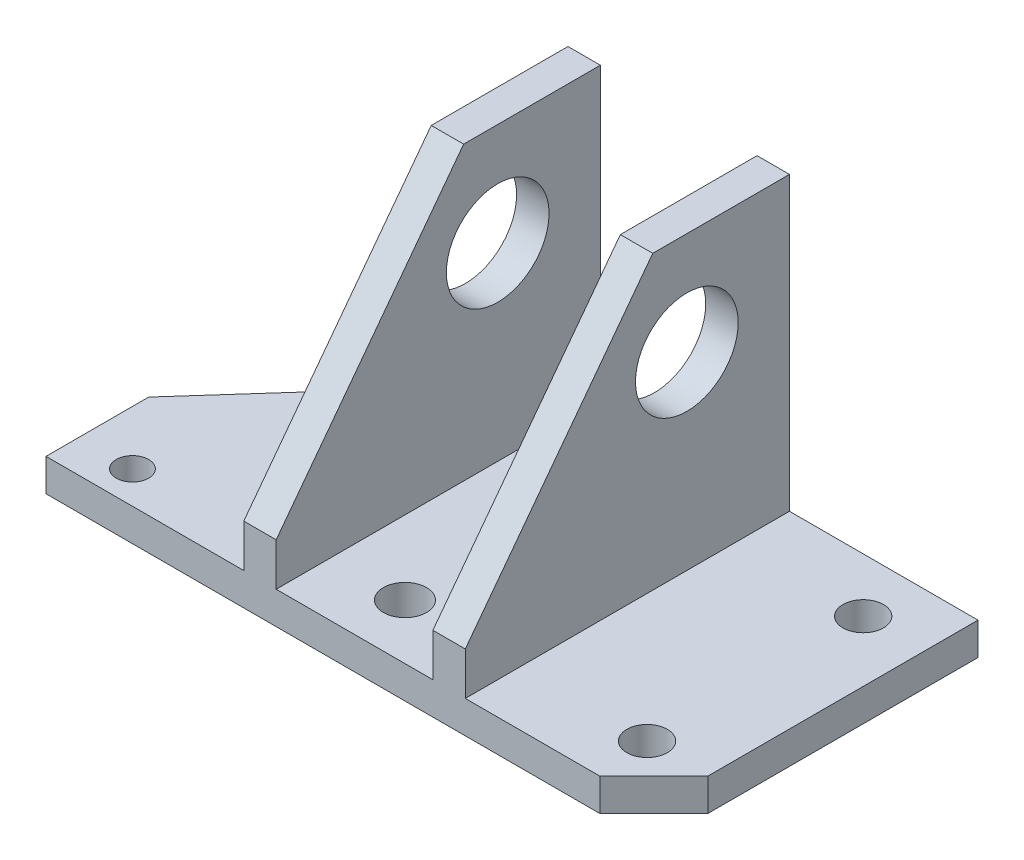
ISO-10303-21;
HEADER;
FILE_DESCRIPTION(('STEP AP214'),'2;1');
FILE_NAME('part.step','',(''),(''),'','','');
FILE_SCHEMA(('AUTOMOTIVE_DESIGN { 1 0 10303 214 1 1 1 1 }'));
ENDSEC;
DATA;
#1=APPLICATION_CONTEXT('core data for automotive mechanical design processes');
#2=APPLICATION_PROTOCOL_DEFINITION('international standard','automotive_design',2000,#1);
#3=PRODUCT_CONTEXT('',#1,'mechanical');
#4=PRODUCT('Part','Part','',(#3));
#5=PRODUCT_RELATED_PRODUCT_CATEGORY('part','',(#4));
#6=PRODUCT_DEFINITION_FORMATION('','',#4);
#7=PRODUCT_DEFINITION_CONTEXT('part definition',#1,'design');
#8=PRODUCT_DEFINITION('design','',#6,#7);
#9=PRODUCT_DEFINITION_SHAPE('','',#8);
#10=(LENGTH_UNIT() NAMED_UNIT(*) SI_UNIT(.MILLI.,.METRE.));
#11=(NAMED_UNIT(*) PLANE_ANGLE_UNIT() SI_UNIT($,.RADIAN.));
#12=(NAMED_UNIT(*) SI_UNIT($,.STERADIAN.) SOLID_ANGLE_UNIT());
#13=UNCERTAINTY_MEASURE_WITH_UNIT(LENGTH_MEASURE(1.E-05),#10,'distance_accuracy_value','');
#14=(GEOMETRIC_REPRESENTATION_CONTEXT(3) GLOBAL_UNCERTAINTY_ASSIGNED_CONTEXT((#13)) GLOBAL_UNIT_ASSIGNED_CONTEXT((#10,
#11,#12)) REPRESENTATION_CONTEXT('',''));
#15=CARTESIAN_POINT('',(0.,0.,0.));
#16=DIRECTION('',(0.,0.,1.));
#17=DIRECTION('',(1.,0.,0.));
#18=AXIS2_PLACEMENT_3D('',#15,#16,#17);
#19=CARTESIAN_POINT('',(-39.2880274057925,0.,60.));
#20=DIRECTION('',(0.,-1.,0.));
#21=DIRECTION('',(0.,0.,-1.));
#22=AXIS2_PLACEMENT_3D('',#19,#20,#21);
#23=PLANE('',#22);
#24=CARTESIAN_POINT('',(-92.5,0.,48.));
#25=DIRECTION('',(0.,1.,0.));
#26=DIRECTION('',(0.,0.,1.));
#27=AXIS2_PLACEMENT_3D('',#24,#25,#26);
#28=CIRCLE('',#27,6.);
#29=CARTESIAN_POINT('',(-92.5,0.,54.));
#30=VERTEX_POINT('',#29);
#31=EDGE_CURVE('E356',#30,#30,#28,.T.);
#32=ORIENTED_EDGE('',*,*,#31,.F.);
#33=EDGE_LOOP('',(#32));
#34=FACE_BOUND('',#33,.T.);
#35=DIRECTION('',(0.,0.,-1.));
#36=VECTOR('',#35,1.);
#37=CARTESIAN_POINT('',(-39.2880274057925,0.,60.));
#38=LINE('',#37,#36);
#39=CARTESIAN_POINT('',(-39.2880274057925,0.,60.));
#40=VERTEX_POINT('',#39);
#41=CARTESIAN_POINT('',(-39.2880274057925,0.,-60.));
#42=VERTEX_POINT('',#41);
#43=EDGE_CURVE('E162',#40,#42,#38,.T.);
#44=ORIENTED_EDGE('',*,*,#43,.T.);
#45=DIRECTION('',(0.666015736772443,0.,-0.745937690676279));
#46=VECTOR('',#45,1.);
#47=CARTESIAN_POINT('',(-51.6691380192781,0.,-46.1331548954279));
#48=LINE('',#47,#46);
#49=CARTESIAN_POINT('',(-112.5,0.,21.9974165046452));
#50=VERTEX_POINT('',#49);
#51=EDGE_CURVE('E259',#50,#42,#48,.T.);
#52=ORIENTED_EDGE('',*,*,#51,.F.);
#53=DIRECTION('',(0.,0.,-1.));
#54=VECTOR('',#53,1.);
#55=CARTESIAN_POINT('',(-112.5,0.,60.));
#56=LINE('',#55,#54);
#57=CARTESIAN_POINT('',(-112.5,0.,60.));
#58=VERTEX_POINT('',#57);
#59=EDGE_CURVE('E220',#58,#50,#56,.T.);
#60=ORIENTED_EDGE('',*,*,#59,.F.);
#61=DIRECTION('',(-1.,0.,0.));
#62=VECTOR('',#61,1.);
#63=CARTESIAN_POINT('',(-39.2880274057925,0.,60.));
#64=LINE('',#63,#62);
#65=EDGE_CURVE('E194',#40,#58,#64,.T.);
#66=ORIENTED_EDGE('',*,*,#65,.F.);
#67=EDGE_LOOP('',(#44,#52,#60,#66));
#68=FACE_BOUND('',#67,.T.);
#69=ADVANCED_FACE('F33',(#34,#68),#23,.F.);
#70=CARTESIAN_POINT('',(-112.5,0.,60.));
#71=DIRECTION('',(1.,0.,0.));
#72=DIRECTION('',(0.,0.,-1.));
#73=AXIS2_PLACEMENT_3D('',#70,#71,#72);
#74=PLANE('',#73);
#75=ORIENTED_EDGE('',*,*,#59,.T.);
#76=DIRECTION('',(0.,1.,0.));
#77=VECTOR('',#76,1.);
#78=CARTESIAN_POINT('',(-112.5,-120.,21.9974165046452));
#79=LINE('',#78,#77);
#80=CARTESIAN_POINT('',(-112.5,-12.,21.9974165046452));
#81=VERTEX_POINT('',#80);
#82=EDGE_CURVE('E261',#81,#50,#79,.T.);
#83=ORIENTED_EDGE('',*,*,#82,.F.);
#84=DIRECTION('',(0.,0.,-1.));
#85=VECTOR('',#84,1.);
#86=CARTESIAN_POINT('',(-112.5,-12.,60.));
#87=LINE('',#86,#85);
#88=CARTESIAN_POINT('',(-112.5,-12.,60.));
#89=VERTEX_POINT('',#88);
#90=EDGE_CURVE('E217',#89,#81,#87,.T.);
#91=ORIENTED_EDGE('',*,*,#90,.F.);
#92=DIRECTION('',(0.,-1.,0.));
#93=VECTOR('',#92,1.);
#94=CARTESIAN_POINT('',(-112.5,0.,60.));
#95=LINE('',#94,#93);
#96=EDGE_CURVE('E274',#58,#89,#95,.T.);
#97=ORIENTED_EDGE('',*,*,#96,.F.);
#98=EDGE_LOOP('',(#75,#83,#91,#97));
#99=FACE_BOUND('',#98,.T.);
#100=ADVANCED_FACE('F310',(#99),#74,.F.);
#101=CARTESIAN_POINT('',(-112.5,-12.,60.));
#102=DIRECTION('',(0.,1.,0.));
#103=DIRECTION('',(-1.,0.,0.));
#104=AXIS2_PLACEMENT_3D('',#101,#102,#103);
#105=PLANE('',#104);
#106=CARTESIAN_POINT('',(90.,-12.,-40.));
#107=DIRECTION('',(0.,1.,0.));
#108=DIRECTION('',(-1.,0.,0.));
#109=AXIS2_PLACEMENT_3D('',#106,#107,#108);
#110=CIRCLE('',#109,7.50747814202877);
#111=CARTESIAN_POINT('',(82.4925218579712,-12.,-40.));
#112=VERTEX_POINT('',#111);
#113=EDGE_CURVE('E372',#112,#112,#110,.T.);
#114=ORIENTED_EDGE('',*,*,#113,.T.);
#115=EDGE_LOOP('',(#114));
#116=FACE_BOUND('',#115,.T.);
#117=CARTESIAN_POINT('',(0.,-12.,39.6259148494393));
#118=DIRECTION('',(0.,1.,0.));
#119=DIRECTION('',(-1.,0.,0.));
#120=AXIS2_PLACEMENT_3D('',#117,#118,#119);
#121=CIRCLE('',#120,8.);
#122=CARTESIAN_POINT('',(-8.,-12.,39.6259148494393));
#123=VERTEX_POINT('',#122);
#124=EDGE_CURVE('E358',#123,#123,#121,.T.);
#125=ORIENTED_EDGE('',*,*,#124,.T.);
#126=EDGE_LOOP('',(#125));
#127=FACE_BOUND('',#126,.T.);
#128=CARTESIAN_POINT('',(90.,-12.,40.));
#129=DIRECTION('',(0.,1.,0.));
#130=DIRECTION('',(-1.,0.,0.));
#131=AXIS2_PLACEMENT_3D('',#128,#129,#130);
#132=CIRCLE('',#131,7.50747814202877);
#133=CARTESIAN_POINT('',(82.4925218579712,-12.,40.));
#134=VERTEX_POINT('',#133);
#135=EDGE_CURVE('E362',#134,#134,#132,.T.);
#136=ORIENTED_EDGE('',*,*,#135,.T.);
#137=EDGE_LOOP('',(#136));
#138=FACE_BOUND('',#137,.T.);
#139=CARTESIAN_POINT('',(-92.5,-12.,48.));
#140=DIRECTION('',(0.,1.,0.));
#141=DIRECTION('',(-1.,0.,0.));
#142=AXIS2_PLACEMENT_3D('',#139,#140,#141);
#143=CIRCLE('',#142,6.);
#144=CARTESIAN_POINT('',(-98.5,-12.,48.));
#145=VERTEX_POINT('',#144);
#146=EDGE_CURVE('E36',#145,#145,#143,.T.);
#147=ORIENTED_EDGE('',*,*,#146,.T.);
#148=EDGE_LOOP('',(#147));
#149=FACE_BOUND('',#148,.T.);
#150=CARTESIAN_POINT('',(0.,-12.,-39.6259148494393));
#151=DIRECTION('',(0.,1.,0.));
#152=DIRECTION('',(-1.,0.,0.));
#153=AXIS2_PLACEMENT_3D('',#150,#151,#152);
#154=CIRCLE('',#153,8.);
#155=CARTESIAN_POINT('',(-8.,-12.,-39.6259148494393));
#156=VERTEX_POINT('',#155);
#157=EDGE_CURVE('E230',#156,#156,#154,.T.);
#158=ORIENTED_EDGE('',*,*,#157,.T.);
#159=EDGE_LOOP('',(#158));
#160=FACE_BOUND('',#159,.T.);
#161=ORIENTED_EDGE('',*,*,#90,.T.);
#162=DIRECTION('',(0.666015736772443,0.,-0.745937690676279));
#163=VECTOR('',#162,1.);
#164=CARTESIAN_POINT('',(-131.379920641015,-12.,43.1429294790956));
#165=LINE('',#164,#163);
#166=CARTESIAN_POINT('',(-39.2880274057925,-12.,-60.));
#167=VERTEX_POINT('',#166);
#168=EDGE_CURVE('E263',#81,#167,#165,.T.);
#169=ORIENTED_EDGE('',*,*,#168,.T.);
#170=DIRECTION('',(1.,0.,0.));
#171=VECTOR('',#170,1.);
#172=CARTESIAN_POINT('',(-112.5,-12.,-60.));
#173=LINE('',#172,#171);
#174=CARTESIAN_POINT('',(112.5,-12.,-60.));
#175=VERTEX_POINT('',#174);
#176=EDGE_CURVE('E168',#167,#175,#173,.T.);
#177=ORIENTED_EDGE('',*,*,#176,.T.);
#178=DIRECTION('',(0.,0.,-1.));
#179=VECTOR('',#178,1.);
#180=CARTESIAN_POINT('',(112.5,-12.,60.));
#181=LINE('',#180,#179);
#182=CARTESIAN_POINT('',(112.5,-12.,40.0044285512044));
#183=VERTEX_POINT('',#182);
#184=EDGE_CURVE('E214',#183,#175,#181,.T.);
#185=ORIENTED_EDGE('',*,*,#184,.F.);
#186=DIRECTION('',(-0.707185071984451,0.,0.707028481719334));
#187=VECTOR('',#186,1.);
#188=CARTESIAN_POINT('',(-10.022698837719,-12.,162.499997486648));
#189=LINE('',#188,#187);
#190=CARTESIAN_POINT('',(92.5,-12.,60.));
#191=VERTEX_POINT('',#190);
#192=EDGE_CURVE('E171',#183,#191,#189,.T.);
#193=ORIENTED_EDGE('',*,*,#192,.T.);
#194=DIRECTION('',(1.,0.,0.));
#195=VECTOR('',#194,1.);
#196=CARTESIAN_POINT('',(-112.5,-12.,60.));
#197=LINE('',#196,#195);
#198=EDGE_CURVE('E276',#89,#191,#197,.T.);
#199=ORIENTED_EDGE('',*,*,#198,.F.);
#200=EDGE_LOOP('',(#161,#169,#177,#185,#193,#199));
#201=FACE_BOUND('',#200,.T.);
#202=ADVANCED_FACE('F313',(#116,#127,#138,#149,#160,#201),#105,.F.);
#203=CARTESIAN_POINT('',(112.5,-12.,60.));
#204=DIRECTION('',(-1.,0.,0.));
#205=DIRECTION('',(0.,-1.,0.));
#206=AXIS2_PLACEMENT_3D('',#203,#204,#205);
#207=PLANE('',#206);
#208=DIRECTION('',(0.,0.,-1.));
#209=VECTOR('',#208,1.);
#210=CARTESIAN_POINT('',(112.5,0.,60.));
#211=LINE('',#210,#209);
#212=CARTESIAN_POINT('',(112.5,0.,40.0044285512044));
#213=VERTEX_POINT('',#212);
#214=CARTESIAN_POINT('',(112.5,0.,-60.));
#215=VERTEX_POINT('',#214);
#216=EDGE_CURVE('E212',#213,#215,#211,.T.);
#217=ORIENTED_EDGE('',*,*,#216,.F.);
#218=DIRECTION('',(0.,1.,0.));
#219=VECTOR('',#218,1.);
#220=CARTESIAN_POINT('',(112.5,-120.,40.0044285512044));
#221=LINE('',#220,#219);
#222=EDGE_CURVE('E268',#183,#213,#221,.T.);
#223=ORIENTED_EDGE('',*,*,#222,.F.);
#224=ORIENTED_EDGE('',*,*,#184,.T.);
#225=DIRECTION('',(0.,1.,0.));
#226=VECTOR('',#225,1.);
#227=CARTESIAN_POINT('',(112.5,-12.,-60.));
#228=LINE('',#227,#226);
#229=EDGE_CURVE('E170',#175,#215,#228,.T.);
#230=ORIENTED_EDGE('',*,*,#229,.T.);
#231=EDGE_LOOP('',(#217,#223,#224,#230));
#232=FACE_BOUND('',#231,.T.);
#233=ADVANCED_FACE('F336',(#232),#207,.F.);
#234=CARTESIAN_POINT('',(112.5,0.,60.));
#235=DIRECTION('',(0.,-1.,0.));
#236=DIRECTION('',(1.,0.,0.));
#237=AXIS2_PLACEMENT_3D('',#234,#235,#236);
#238=PLANE('',#237);
#239=CARTESIAN_POINT('',(90.,0.,-40.));
#240=DIRECTION('',(0.,1.,0.));
#241=DIRECTION('',(0.,0.,-1.));
#242=AXIS2_PLACEMENT_3D('',#239,#240,#241);
#243=CIRCLE('',#242,7.50747814202877);
#244=CARTESIAN_POINT('',(90.,0.,-47.5074781420288));
#245=VERTEX_POINT('',#244);
#246=EDGE_CURVE('E368',#245,#245,#243,.T.);
#247=ORIENTED_EDGE('',*,*,#246,.F.);
#248=EDGE_LOOP('',(#247));
#249=FACE_BOUND('',#248,.T.);
#250=CARTESIAN_POINT('',(90.,0.,40.));
#251=DIRECTION('',(0.,1.,0.));
#252=DIRECTION('',(0.,0.,1.));
#253=AXIS2_PLACEMENT_3D('',#250,#251,#252);
#254=CIRCLE('',#253,7.50747814202877);
#255=CARTESIAN_POINT('',(90.,0.,47.5074781420288));
#256=VERTEX_POINT('',#255);
#257=EDGE_CURVE('E359',#256,#256,#254,.T.);
#258=ORIENTED_EDGE('',*,*,#257,.F.);
#259=EDGE_LOOP('',(#258));
#260=FACE_BOUND('',#259,.T.);
#261=DIRECTION('',(-1.,0.,0.));
#262=VECTOR('',#261,1.);
#263=CARTESIAN_POINT('',(112.5,0.,60.));
#264=LINE('',#263,#262);
#265=CARTESIAN_POINT('',(92.5,0.,60.));
#266=VERTEX_POINT('',#265);
#267=CARTESIAN_POINT('',(42.7119725942075,0.,60.));
#268=VERTEX_POINT('',#267);
#269=EDGE_CURVE('E279',#266,#268,#264,.T.);
#270=ORIENTED_EDGE('',*,*,#269,.F.);
#271=DIRECTION('',(-0.707185071984451,0.,0.707028481719334));
#272=VECTOR('',#271,1.);
#273=CARTESIAN_POINT('',(76.2397571059017,0.,76.2566424281856));
#274=LINE('',#273,#272);
#275=EDGE_CURVE('E266',#213,#266,#274,.T.);
#276=ORIENTED_EDGE('',*,*,#275,.F.);
#277=ORIENTED_EDGE('',*,*,#216,.T.);
#278=DIRECTION('',(-1.,0.,0.));
#279=VECTOR('',#278,1.);
#280=CARTESIAN_POINT('',(112.5,0.,-60.));
#281=LINE('',#280,#279);
#282=CARTESIAN_POINT('',(42.7119725942075,0.,-60.));
#283=VERTEX_POINT('',#282);
#284=EDGE_CURVE('E174',#215,#283,#281,.T.);
#285=ORIENTED_EDGE('',*,*,#284,.T.);
#286=DIRECTION('',(0.,0.,-1.));
#287=VECTOR('',#286,1.);
#288=CARTESIAN_POINT('',(42.7119725942075,0.,60.));
#289=LINE('',#288,#287);
#290=EDGE_CURVE('E209',#268,#283,#289,.T.);
#291=ORIENTED_EDGE('',*,*,#290,.F.);
#292=EDGE_LOOP('',(#270,#276,#277,#285,#291));
#293=FACE_BOUND('',#292,.T.);
#294=ADVANCED_FACE('F321',(#249,#260,#293),#238,.F.);
#295=CARTESIAN_POINT('',(42.7119725942075,0.,60.));
#296=DIRECTION('',(-1.,0.,0.));
#297=DIRECTION('',(0.,-1.,0.));
#298=AXIS2_PLACEMENT_3D('',#295,#296,#297);
#299=PLANE('',#298);
#300=CARTESIAN_POINT('',(42.7119725942075,70.,-22.));
#301=DIRECTION('',(-1.,0.,0.));
#302=DIRECTION('',(0.,-1.,0.));
#303=AXIS2_PLACEMENT_3D('',#300,#301,#302);
#304=CIRCLE('',#303,19.);
#305=CARTESIAN_POINT('',(42.7119725942075,51.,-22.));
#306=VERTEX_POINT('',#305);
#307=EDGE_CURVE('E247',#306,#306,#304,.T.);
#308=ORIENTED_EDGE('',*,*,#307,.T.);
#309=EDGE_LOOP('',(#308));
#310=FACE_BOUND('',#309,.T.);
#311=DIRECTION('',(0.,0.,-1.));
#312=VECTOR('',#311,1.);
#313=CARTESIAN_POINT('',(42.7119725942075,108.,60.));
#314=LINE('',#313,#312);
#315=CARTESIAN_POINT('',(42.7119725942075,108.,-9.38887017346701));
#316=VERTEX_POINT('',#315);
#317=CARTESIAN_POINT('',(42.7119725942075,108.,-60.));
#318=VERTEX_POINT('',#317);
#319=EDGE_CURVE('E207',#316,#318,#314,.T.);
#320=ORIENTED_EDGE('',*,*,#319,.F.);
#321=DIRECTION('',(0.,-0.798832459695863,0.601553573122343));
#322=VECTOR('',#321,1.);
#323=CARTESIAN_POINT('',(42.7119725942075,5.73743995729337,67.6190275949202));
#324=LINE('',#323,#322);
#325=CARTESIAN_POINT('',(42.7119725942075,15.8551199546873,60.));
#326=VERTEX_POINT('',#325);
#327=EDGE_CURVE('E256',#316,#326,#324,.T.);
#328=ORIENTED_EDGE('',*,*,#327,.T.);
#329=DIRECTION('',(0.,1.,0.));
#330=VECTOR('',#329,1.);
#331=CARTESIAN_POINT('',(42.7119725942075,0.,60.));
#332=LINE('',#331,#330);
#333=EDGE_CURVE('E281',#268,#326,#332,.T.);
#334=ORIENTED_EDGE('',*,*,#333,.F.);
#335=ORIENTED_EDGE('',*,*,#290,.T.);
#336=DIRECTION('',(0.,1.,0.));
#337=VECTOR('',#336,1.);
#338=CARTESIAN_POINT('',(42.7119725942075,0.,-60.));
#339=LINE('',#338,#337);
#340=EDGE_CURVE('E176',#283,#318,#339,.T.);
#341=ORIENTED_EDGE('',*,*,#340,.T.);
#342=EDGE_LOOP('',(#320,#328,#334,#335,#341));
#343=FACE_BOUND('',#342,.T.);
#344=ADVANCED_FACE('F328',(#310,#343),#299,.F.);
#345=CARTESIAN_POINT('',(42.7119725942075,108.,60.));
#346=DIRECTION('',(0.,-1.,0.));
#347=DIRECTION('',(0.,0.,-1.));
#348=AXIS2_PLACEMENT_3D('',#345,#346,#347);
#349=PLANE('',#348);
#350=DIRECTION('',(0.,0.,-1.));
#351=VECTOR('',#350,1.);
#352=CARTESIAN_POINT('',(30.7119725942075,108.,60.));
#353=LINE('',#352,#351);
#354=CARTESIAN_POINT('',(30.7119725942075,108.,-9.38887017346701));
#355=VERTEX_POINT('',#354);
#356=CARTESIAN_POINT('',(30.7119725942075,108.,-60.));
#357=VERTEX_POINT('',#356);
#358=EDGE_CURVE('E205',#355,#357,#353,.T.);
#359=ORIENTED_EDGE('',*,*,#358,.F.);
#360=DIRECTION('',(1.,0.,0.));
#361=VECTOR('',#360,1.);
#362=CARTESIAN_POINT('',(-60.,108.,-9.38887017346701));
#363=LINE('',#362,#361);
#364=EDGE_CURVE('E250',#355,#316,#363,.T.);
#365=ORIENTED_EDGE('',*,*,#364,.T.);
#366=ORIENTED_EDGE('',*,*,#319,.T.);
#367=DIRECTION('',(-1.,0.,0.));
#368=VECTOR('',#367,1.);
#369=CARTESIAN_POINT('',(42.7119725942075,108.,-60.));
#370=LINE('',#369,#368);
#371=EDGE_CURVE('E179',#318,#357,#370,.T.);
#372=ORIENTED_EDGE('',*,*,#371,.T.);
#373=EDGE_LOOP('',(#359,#365,#366,#372));
#374=FACE_BOUND('',#373,.T.);
#375=ADVANCED_FACE('F332',(#374),#349,.F.);
#376=CARTESIAN_POINT('',(30.7119725942075,108.,60.));
#377=DIRECTION('',(1.,0.,0.));
#378=DIRECTION('',(0.,1.,0.));
#379=AXIS2_PLACEMENT_3D('',#376,#377,#378);
#380=PLANE('',#379);
#381=CARTESIAN_POINT('',(30.7119725942075,70.,-22.));
#382=DIRECTION('',(1.,0.,0.));
#383=DIRECTION('',(0.,1.,0.));
#384=AXIS2_PLACEMENT_3D('',#381,#382,#383);
#385=CIRCLE('',#384,19.);
#386=CARTESIAN_POINT('',(30.7119725942075,89.,-22.));
#387=VERTEX_POINT('',#386);
#388=EDGE_CURVE('E234',#387,#387,#385,.T.);
#389=ORIENTED_EDGE('',*,*,#388,.T.);
#390=EDGE_LOOP('',(#389));
#391=FACE_BOUND('',#390,.T.);
#392=DIRECTION('',(0.,-1.,0.));
#393=VECTOR('',#392,1.);
#394=CARTESIAN_POINT('',(30.7119725942075,108.,60.));
#395=LINE('',#394,#393);
#396=CARTESIAN_POINT('',(30.7119725942075,15.8551199546873,60.));
#397=VERTEX_POINT('',#396);
#398=CARTESIAN_POINT('',(30.7119725942075,0.,60.));
#399=VERTEX_POINT('',#398);
#400=EDGE_CURVE('E164',#397,#399,#395,.T.);
#401=ORIENTED_EDGE('',*,*,#400,.F.);
#402=DIRECTION('',(0.,0.798832459695863,-0.601553573122343));
#403=VECTOR('',#402,1.);
#404=CARTESIAN_POINT('',(30.7119725942075,74.6558362129775,15.7206513856554));
#405=LINE('',#404,#403);
#406=EDGE_CURVE('E56',#397,#355,#405,.T.);
#407=ORIENTED_EDGE('',*,*,#406,.T.);
#408=ORIENTED_EDGE('',*,*,#358,.T.);
#409=DIRECTION('',(0.,-1.,0.));
#410=VECTOR('',#409,1.);
#411=CARTESIAN_POINT('',(30.7119725942075,108.,-60.));
#412=LINE('',#411,#410);
#413=CARTESIAN_POINT('',(30.7119725942075,0.,-60.));
#414=VERTEX_POINT('',#413);
#415=EDGE_CURVE('E182',#357,#414,#412,.T.);
#416=ORIENTED_EDGE('',*,*,#415,.T.);
#417=DIRECTION('',(0.,0.,-1.));
#418=VECTOR('',#417,1.);
#419=CARTESIAN_POINT('',(30.7119725942075,0.,60.));
#420=LINE('',#419,#418);
#421=EDGE_CURVE('E202',#399,#414,#420,.T.);
#422=ORIENTED_EDGE('',*,*,#421,.F.);
#423=EDGE_LOOP('',(#401,#407,#408,#416,#422));
#424=FACE_BOUND('',#423,.T.);
#425=ADVANCED_FACE('F286',(#391,#424),#380,.F.);
#426=CARTESIAN_POINT('',(30.7119725942075,0.,60.));
#427=DIRECTION('',(0.,-1.,0.));
#428=DIRECTION('',(1.,0.,0.));
#429=AXIS2_PLACEMENT_3D('',#426,#427,#428);
#430=PLANE('',#429);
#431=CARTESIAN_POINT('',(0.,0.,39.6259148494393));
#432=DIRECTION('',(0.,1.,0.));
#433=DIRECTION('',(0.,0.,-1.));
#434=AXIS2_PLACEMENT_3D('',#431,#432,#433);
#435=CIRCLE('',#434,8.);
#436=CARTESIAN_POINT('',(0.,0.,31.6259148494393));
#437=VERTEX_POINT('',#436);
#438=EDGE_CURVE('E365',#437,#437,#435,.T.);
#439=ORIENTED_EDGE('',*,*,#438,.F.);
#440=EDGE_LOOP('',(#439));
#441=FACE_BOUND('',#440,.T.);
#442=CARTESIAN_POINT('',(0.,0.,-39.6259148494393));
#443=DIRECTION('',(0.,1.,0.));
#444=DIRECTION('',(0.,0.,1.));
#445=AXIS2_PLACEMENT_3D('',#442,#443,#444);
#446=CIRCLE('',#445,8.);
#447=CARTESIAN_POINT('',(0.,0.,-31.6259148494393));
#448=VERTEX_POINT('',#447);
#449=EDGE_CURVE('E237',#448,#448,#446,.T.);
#450=ORIENTED_EDGE('',*,*,#449,.F.);
#451=EDGE_LOOP('',(#450));
#452=FACE_BOUND('',#451,.T.);
#453=DIRECTION('',(-1.,0.,0.));
#454=VECTOR('',#453,1.);
#455=CARTESIAN_POINT('',(30.7119725942075,0.,-60.));
#456=LINE('',#455,#454);
#457=CARTESIAN_POINT('',(-27.2880274057925,0.,-60.));
#458=VERTEX_POINT('',#457);
#459=EDGE_CURVE('E184',#414,#458,#456,.T.);
#460=ORIENTED_EDGE('',*,*,#459,.T.);
#461=DIRECTION('',(0.,0.,-1.));
#462=VECTOR('',#461,1.);
#463=CARTESIAN_POINT('',(-27.2880274057925,0.,60.));
#464=LINE('',#463,#462);
#465=CARTESIAN_POINT('',(-27.2880274057925,0.,60.));
#466=VERTEX_POINT('',#465);
#467=EDGE_CURVE('E200',#466,#458,#464,.T.);
#468=ORIENTED_EDGE('',*,*,#467,.F.);
#469=DIRECTION('',(-1.,0.,0.));
#470=VECTOR('',#469,1.);
#471=CARTESIAN_POINT('',(30.7119725942075,0.,60.));
#472=LINE('',#471,#470);
#473=EDGE_CURVE('E158',#399,#466,#472,.T.);
#474=ORIENTED_EDGE('',*,*,#473,.F.);
#475=ORIENTED_EDGE('',*,*,#421,.T.);
#476=EDGE_LOOP('',(#460,#468,#474,#475));
#477=FACE_BOUND('',#476,.T.);
#478=ADVANCED_FACE('F290',(#441,#452,#477),#430,.F.);
#479=CARTESIAN_POINT('',(-27.2880274057925,0.,60.));
#480=DIRECTION('',(-1.,0.,0.));
#481=DIRECTION('',(0.,-1.,0.));
#482=AXIS2_PLACEMENT_3D('',#479,#480,#481);
#483=PLANE('',#482);
#484=CARTESIAN_POINT('',(-27.2880274057925,70.,-22.));
#485=DIRECTION('',(-1.,0.,0.));
#486=DIRECTION('',(0.,-1.,0.));
#487=AXIS2_PLACEMENT_3D('',#484,#485,#486);
#488=CIRCLE('',#487,19.);
#489=CARTESIAN_POINT('',(-27.2880274057925,51.,-22.));
#490=VERTEX_POINT('',#489);
#491=EDGE_CURVE('E229',#490,#490,#488,.T.);
#492=ORIENTED_EDGE('',*,*,#491,.T.);
#493=EDGE_LOOP('',(#492));
#494=FACE_BOUND('',#493,.T.);
#495=DIRECTION('',(0.,0.,-1.));
#496=VECTOR('',#495,1.);
#497=CARTESIAN_POINT('',(-27.2880274057925,108.,60.));
#498=LINE('',#497,#496);
#499=CARTESIAN_POINT('',(-27.2880274057925,108.,-9.38887017346701));
#500=VERTEX_POINT('',#499);
#501=CARTESIAN_POINT('',(-27.2880274057925,108.,-60.));
#502=VERTEX_POINT('',#501);
#503=EDGE_CURVE('E154',#500,#502,#498,.T.);
#504=ORIENTED_EDGE('',*,*,#503,.F.);
#505=DIRECTION('',(0.,-0.798832459695863,0.601553573122343));
#506=VECTOR('',#505,1.);
#507=CARTESIAN_POINT('',(-27.2880274057925,5.73743995729338,67.6190275949202));
#508=LINE('',#507,#506);
#509=CARTESIAN_POINT('',(-27.2880274057925,15.8551199546873,60.));
#510=VERTEX_POINT('',#509);
#511=EDGE_CURVE('E142',#500,#510,#508,.T.);
#512=ORIENTED_EDGE('',*,*,#511,.T.);
#513=DIRECTION('',(0.,1.,0.));
#514=VECTOR('',#513,1.);
#515=CARTESIAN_POINT('',(-27.2880274057925,0.,60.));
#516=LINE('',#515,#514);
#517=EDGE_CURVE('E152',#466,#510,#516,.T.);
#518=ORIENTED_EDGE('',*,*,#517,.F.);
#519=ORIENTED_EDGE('',*,*,#467,.T.);
#520=DIRECTION('',(0.,1.,0.));
#521=VECTOR('',#520,1.);
#522=CARTESIAN_POINT('',(-27.2880274057925,0.,-60.));
#523=LINE('',#522,#521);
#524=EDGE_CURVE('E186',#458,#502,#523,.T.);
#525=ORIENTED_EDGE('',*,*,#524,.T.);
#526=EDGE_LOOP('',(#504,#512,#518,#519,#525));
#527=FACE_BOUND('',#526,.T.);
#528=ADVANCED_FACE('F150',(#494,#527),#483,.F.);
#529=CARTESIAN_POINT('',(-27.2880274057925,108.,60.));
#530=DIRECTION('',(0.,-1.,0.));
#531=DIRECTION('',(0.,0.,-1.));
#532=AXIS2_PLACEMENT_3D('',#529,#530,#531);
#533=PLANE('',#532);
#534=DIRECTION('',(0.,0.,-1.));
#535=VECTOR('',#534,1.);
#536=CARTESIAN_POINT('',(-39.2880274057925,108.,60.));
#537=LINE('',#536,#535);
#538=CARTESIAN_POINT('',(-39.2880274057925,108.,-9.38887017346701));
#539=VERTEX_POINT('',#538);
#540=CARTESIAN_POINT('',(-39.2880274057925,108.,-60.));
#541=VERTEX_POINT('',#540);
#542=EDGE_CURVE('E197',#539,#541,#537,.T.);
#543=ORIENTED_EDGE('',*,*,#542,.F.);
#544=EDGE_CURVE('E253',#539,#500,#363,.T.);
#545=ORIENTED_EDGE('',*,*,#544,.T.);
#546=ORIENTED_EDGE('',*,*,#503,.T.);
#547=DIRECTION('',(-1.,0.,0.));
#548=VECTOR('',#547,1.);
#549=CARTESIAN_POINT('',(-27.2880274057925,108.,-60.));
#550=LINE('',#549,#548);
#551=EDGE_CURVE('E188',#502,#541,#550,.T.);
#552=ORIENTED_EDGE('',*,*,#551,.T.);
#553=EDGE_LOOP('',(#543,#545,#546,#552));
#554=FACE_BOUND('',#553,.T.);
#555=ADVANCED_FACE('F299',(#554),#533,.F.);
#556=CARTESIAN_POINT('',(-39.2880274057925,108.,60.));
#557=DIRECTION('',(1.,0.,0.));
#558=DIRECTION('',(0.,1.,0.));
#559=AXIS2_PLACEMENT_3D('',#556,#557,#558);
#560=PLANE('',#559);
#561=CARTESIAN_POINT('',(-39.2880274057925,70.,-22.));
#562=DIRECTION('',(1.,0.,0.));
#563=DIRECTION('',(0.,1.,0.));
#564=AXIS2_PLACEMENT_3D('',#561,#562,#563);
#565=CIRCLE('',#564,19.);
#566=CARTESIAN_POINT('',(-39.2880274057925,89.,-22.));
#567=VERTEX_POINT('',#566);
#568=EDGE_CURVE('E227',#567,#567,#565,.T.);
#569=ORIENTED_EDGE('',*,*,#568,.T.);
#570=EDGE_LOOP('',(#569));
#571=FACE_BOUND('',#570,.T.);
#572=DIRECTION('',(0.,-1.,0.));
#573=VECTOR('',#572,1.);
#574=CARTESIAN_POINT('',(-39.2880274057925,108.,60.));
#575=LINE('',#574,#573);
#576=CARTESIAN_POINT('',(-39.2880274057925,15.8551199546873,60.));
#577=VERTEX_POINT('',#576);
#578=EDGE_CURVE('E160',#577,#40,#575,.T.);
#579=ORIENTED_EDGE('',*,*,#578,.F.);
#580=DIRECTION('',(0.,0.798832459695863,-0.601553573122343));
#581=VECTOR('',#580,1.);
#582=CARTESIAN_POINT('',(-39.2880274057925,74.6558362129775,15.7206513856554));
#583=LINE('',#582,#581);
#584=EDGE_CURVE('E48',#577,#539,#583,.T.);
#585=ORIENTED_EDGE('',*,*,#584,.T.);
#586=ORIENTED_EDGE('',*,*,#542,.T.);
#587=DIRECTION('',(0.,-1.,0.));
#588=VECTOR('',#587,1.);
#589=CARTESIAN_POINT('',(-39.2880274057925,108.,-60.));
#590=LINE('',#589,#588);
#591=EDGE_CURVE('E191',#541,#42,#590,.T.);
#592=ORIENTED_EDGE('',*,*,#591,.T.);
#593=ORIENTED_EDGE('',*,*,#43,.F.);
#594=EDGE_LOOP('',(#579,#585,#586,#592,#593));
#595=FACE_BOUND('',#594,.T.);
#596=ADVANCED_FACE('F301',(#571,#595),#560,.F.);
#597=CARTESIAN_POINT('',(0.,0.,60.));
#598=DIRECTION('',(0.,0.,1.));
#599=DIRECTION('',(1.,0.,0.));
#600=AXIS2_PLACEMENT_3D('',#597,#598,#599);
#601=PLANE('',#600);
#602=DIRECTION('',(1.,0.,0.));
#603=VECTOR('',#602,1.);
#604=CARTESIAN_POINT('',(0.,15.8551199546873,60.));
#605=LINE('',#604,#603);
#606=EDGE_CURVE('E11',#577,#510,#605,.T.);
#607=ORIENTED_EDGE('',*,*,#606,.F.);
#608=ORIENTED_EDGE('',*,*,#578,.T.);
#609=ORIENTED_EDGE('',*,*,#65,.T.);
#610=ORIENTED_EDGE('',*,*,#96,.T.);
#611=ORIENTED_EDGE('',*,*,#198,.T.);
#612=DIRECTION('',(0.,-1.,0.));
#613=VECTOR('',#612,1.);
#614=CARTESIAN_POINT('',(92.5,0.,60.));
#615=LINE('',#614,#613);
#616=EDGE_CURVE('E223',#266,#191,#615,.T.);
#617=ORIENTED_EDGE('',*,*,#616,.F.);
#618=ORIENTED_EDGE('',*,*,#269,.T.);
#619=ORIENTED_EDGE('',*,*,#333,.T.);
#620=EDGE_CURVE('E41',#397,#326,#605,.T.);
#621=ORIENTED_EDGE('',*,*,#620,.F.);
#622=ORIENTED_EDGE('',*,*,#400,.T.);
#623=ORIENTED_EDGE('',*,*,#473,.T.);
#624=ORIENTED_EDGE('',*,*,#517,.T.);
#625=EDGE_LOOP('',(#607,#608,#609,#610,#611,#617,#618,#619,#621,#622,#623,#624));
#626=FACE_BOUND('',#625,.T.);
#627=ADVANCED_FACE('F156',(#626),#601,.T.);
#628=CARTESIAN_POINT('',(0.,0.,-60.));
#629=DIRECTION('',(0.,0.,1.));
#630=DIRECTION('',(1.,0.,0.));
#631=AXIS2_PLACEMENT_3D('',#628,#629,#630);
#632=PLANE('',#631);
#633=ORIENTED_EDGE('',*,*,#176,.F.);
#634=DIRECTION('',(0.,1.,0.));
#635=VECTOR('',#634,1.);
#636=CARTESIAN_POINT('',(-39.2880274057925,0.,-60.));
#637=LINE('',#636,#635);
#638=EDGE_CURVE('E225',#167,#42,#637,.T.);
#639=ORIENTED_EDGE('',*,*,#638,.T.);
#640=ORIENTED_EDGE('',*,*,#591,.F.);
#641=ORIENTED_EDGE('',*,*,#551,.F.);
#642=ORIENTED_EDGE('',*,*,#524,.F.);
#643=ORIENTED_EDGE('',*,*,#459,.F.);
#644=ORIENTED_EDGE('',*,*,#415,.F.);
#645=ORIENTED_EDGE('',*,*,#371,.F.);
#646=ORIENTED_EDGE('',*,*,#340,.F.);
#647=ORIENTED_EDGE('',*,*,#284,.F.);
#648=ORIENTED_EDGE('',*,*,#229,.F.);
#649=EDGE_LOOP('',(#633,#639,#640,#641,#642,#643,#644,#645,#646,#647,#648));
#650=FACE_BOUND('',#649,.T.);
#651=ADVANCED_FACE('F295',(#650),#632,.F.);
#652=CARTESIAN_POINT('',(76.2397571059017,-120.,76.2566424281856));
#653=DIRECTION('',(-0.707028481719334,0.,-0.707185071984451));
#654=DIRECTION('',(-0.707185071984451,0.,0.707028481719334));
#655=AXIS2_PLACEMENT_3D('',#652,#653,#654);
#656=PLANE('',#655);
#657=ORIENTED_EDGE('',*,*,#222,.T.);
#658=ORIENTED_EDGE('',*,*,#275,.T.);
#659=ORIENTED_EDGE('',*,*,#616,.T.);
#660=ORIENTED_EDGE('',*,*,#192,.F.);
#661=EDGE_LOOP('',(#657,#658,#659,#660));
#662=FACE_BOUND('',#661,.T.);
#663=ADVANCED_FACE('F341',(#662),#656,.F.);
#664=CARTESIAN_POINT('',(-51.6691380192781,-120.,-46.1331548954279));
#665=DIRECTION('',(0.745937690676279,0.,0.666015736772443));
#666=DIRECTION('',(0.666015736772443,0.,-0.745937690676279));
#667=AXIS2_PLACEMENT_3D('',#664,#665,#666);
#668=PLANE('',#667);
#669=ORIENTED_EDGE('',*,*,#82,.T.);
#670=ORIENTED_EDGE('',*,*,#51,.T.);
#671=ORIENTED_EDGE('',*,*,#638,.F.);
#672=ORIENTED_EDGE('',*,*,#168,.F.);
#673=EDGE_LOOP('',(#669,#670,#671,#672));
#674=FACE_BOUND('',#673,.T.);
#675=ADVANCED_FACE('F339',(#674),#668,.F.);
#676=CARTESIAN_POINT('',(-60.,108.,-9.38887017346701));
#677=DIRECTION('',(0.,-0.601553573122343,-0.798832459695862));
#678=DIRECTION('',(0.,0.798832459695863,-0.601553573122343));
#679=AXIS2_PLACEMENT_3D('',#676,#677,#678);
#680=PLANE('',#679);
#681=ORIENTED_EDGE('',*,*,#364,.F.);
#682=ORIENTED_EDGE('',*,*,#406,.F.);
#683=ORIENTED_EDGE('',*,*,#620,.T.);
#684=ORIENTED_EDGE('',*,*,#327,.F.);
#685=EDGE_LOOP('',(#681,#682,#683,#684));
#686=FACE_BOUND('',#685,.T.);
#687=ADVANCED_FACE('F329',(#686),#680,.F.);
#688=ORIENTED_EDGE('',*,*,#544,.F.);
#689=ORIENTED_EDGE('',*,*,#584,.F.);
#690=ORIENTED_EDGE('',*,*,#606,.T.);
#691=ORIENTED_EDGE('',*,*,#511,.F.);
#692=EDGE_LOOP('',(#688,#689,#690,#691));
#693=FACE_BOUND('',#692,.T.);
#694=ADVANCED_FACE('F141',(#693),#680,.F.);
#695=CARTESIAN_POINT('',(-60.,70.,-22.));
#696=DIRECTION('',(1.,0.,0.));
#697=DIRECTION('',(0.,0.,-1.));
#698=AXIS2_PLACEMENT_3D('',#695,#696,#697);
#699=CYLINDRICAL_SURFACE('',#698,19.);
#700=ORIENTED_EDGE('',*,*,#568,.F.);
#701=EDGE_LOOP('',(#700));
#702=FACE_BOUND('',#701,.T.);
#703=ORIENTED_EDGE('',*,*,#491,.F.);
#704=EDGE_LOOP('',(#703));
#705=FACE_BOUND('',#704,.T.);
#706=ADVANCED_FACE('F402',(#702,#705),#699,.F.);
#707=ORIENTED_EDGE('',*,*,#388,.F.);
#708=EDGE_LOOP('',(#707));
#709=FACE_BOUND('',#708,.T.);
#710=ORIENTED_EDGE('',*,*,#307,.F.);
#711=EDGE_LOOP('',(#710));
#712=FACE_BOUND('',#711,.T.);
#713=ADVANCED_FACE('F399',(#709,#712),#699,.F.);
#714=CARTESIAN_POINT('',(0.,-120.,-39.6259148494393));
#715=DIRECTION('',(0.,1.,0.));
#716=DIRECTION('',(0.,0.,1.));
#717=AXIS2_PLACEMENT_3D('',#714,#715,#716);
#718=CYLINDRICAL_SURFACE('',#717,8.);
#719=ORIENTED_EDGE('',*,*,#449,.T.);
#720=EDGE_LOOP('',(#719));
#721=FACE_BOUND('',#720,.T.);
#722=ORIENTED_EDGE('',*,*,#157,.F.);
#723=EDGE_LOOP('',(#722));
#724=FACE_BOUND('',#723,.T.);
#725=ADVANCED_FACE('F396',(#721,#724),#718,.F.);
#726=CARTESIAN_POINT('',(0.,-120.,39.6259148494393));
#727=DIRECTION('',(0.,1.,0.));
#728=DIRECTION('',(0.,0.,1.));
#729=AXIS2_PLACEMENT_3D('',#726,#727,#728);
#730=CYLINDRICAL_SURFACE('',#729,8.);
#731=ORIENTED_EDGE('',*,*,#438,.T.);
#732=EDGE_LOOP('',(#731));
#733=FACE_BOUND('',#732,.T.);
#734=ORIENTED_EDGE('',*,*,#124,.F.);
#735=EDGE_LOOP('',(#734));
#736=FACE_BOUND('',#735,.T.);
#737=ADVANCED_FACE('F394',(#733,#736),#730,.F.);
#738=CARTESIAN_POINT('',(90.,-120.,40.));
#739=DIRECTION('',(0.,1.,0.));
#740=DIRECTION('',(0.,0.,1.));
#741=AXIS2_PLACEMENT_3D('',#738,#739,#740);
#742=CYLINDRICAL_SURFACE('',#741,7.50747814202877);
#743=ORIENTED_EDGE('',*,*,#257,.T.);
#744=EDGE_LOOP('',(#743));
#745=FACE_BOUND('',#744,.T.);
#746=ORIENTED_EDGE('',*,*,#135,.F.);
#747=EDGE_LOOP('',(#746));
#748=FACE_BOUND('',#747,.T.);
#749=ADVANCED_FACE('F387',(#745,#748),#742,.F.);
#750=CARTESIAN_POINT('',(90.,-120.,-40.));
#751=DIRECTION('',(0.,1.,0.));
#752=DIRECTION('',(0.,0.,1.));
#753=AXIS2_PLACEMENT_3D('',#750,#751,#752);
#754=CYLINDRICAL_SURFACE('',#753,7.50747814202877);
#755=ORIENTED_EDGE('',*,*,#246,.T.);
#756=EDGE_LOOP('',(#755));
#757=FACE_BOUND('',#756,.T.);
#758=ORIENTED_EDGE('',*,*,#113,.F.);
#759=EDGE_LOOP('',(#758));
#760=FACE_BOUND('',#759,.T.);
#761=ADVANCED_FACE('F382',(#757,#760),#754,.F.);
#762=CARTESIAN_POINT('',(-92.5,-120.,48.));
#763=DIRECTION('',(0.,1.,0.));
#764=DIRECTION('',(0.,0.,1.));
#765=AXIS2_PLACEMENT_3D('',#762,#763,#764);
#766=CYLINDRICAL_SURFACE('',#765,6.);
#767=ORIENTED_EDGE('',*,*,#31,.T.);
#768=EDGE_LOOP('',(#767));
#769=FACE_BOUND('',#768,.T.);
#770=ORIENTED_EDGE('',*,*,#146,.F.);
#771=EDGE_LOOP('',(#770));
#772=FACE_BOUND('',#771,.T.);
#773=ADVANCED_FACE('F380',(#769,#772),#766,.F.);
#774=CLOSED_SHELL('',(#69,#100,#202,#233,#294,#344,#375,#425,#478,#528,#555,#596,#627,#651,#663,
#675,#687,#694,#706,#713,#725,#737,#749,#761,#773));
#775=MANIFOLD_SOLID_BREP('B2',#774);
#776=ADVANCED_BREP_SHAPE_REPRESENTATION('',(#18,#775),#14);
#777=SHAPE_DEFINITION_REPRESENTATION(#9,#776);
ENDSEC;
END-ISO-10303-21;
